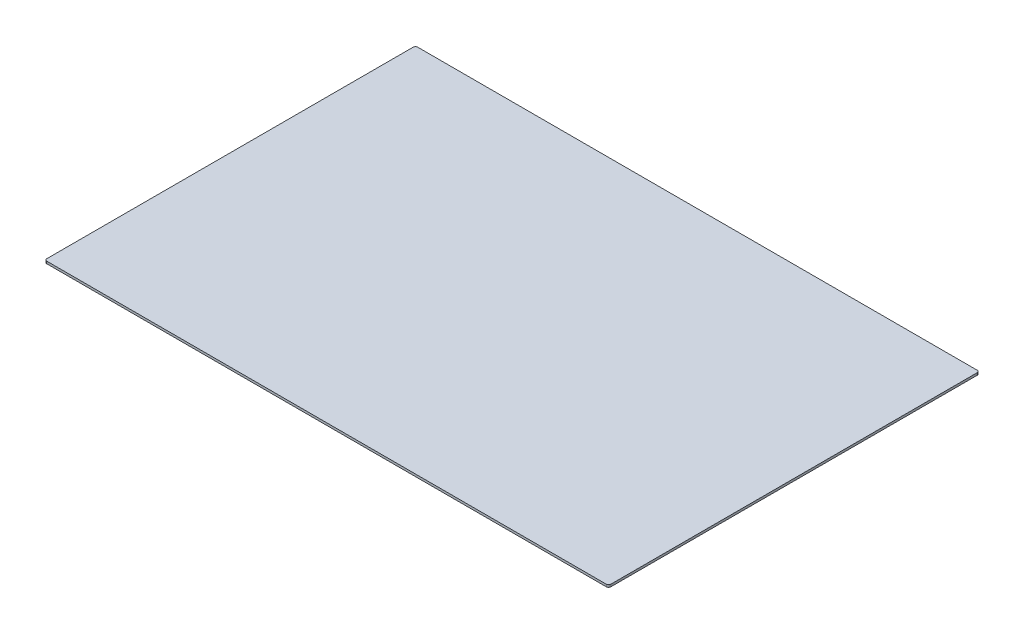
ISO-10303-21;
HEADER;
FILE_DESCRIPTION(('STEP AP214'),'2;1');
FILE_NAME('part.step','',(''),(''),'','','');
FILE_SCHEMA(('AUTOMOTIVE_DESIGN { 1 0 10303 214 1 1 1 1 }'));
ENDSEC;
DATA;
#1=APPLICATION_CONTEXT('core data for automotive mechanical design processes');
#2=APPLICATION_PROTOCOL_DEFINITION('international standard','automotive_design',2000,#1);
#3=PRODUCT_CONTEXT('',#1,'mechanical');
#4=PRODUCT('Part','Part','',(#3));
#5=PRODUCT_RELATED_PRODUCT_CATEGORY('part','',(#4));
#6=PRODUCT_DEFINITION_FORMATION('','',#4);
#7=PRODUCT_DEFINITION_CONTEXT('part definition',#1,'design');
#8=PRODUCT_DEFINITION('design','',#6,#7);
#9=PRODUCT_DEFINITION_SHAPE('','',#8);
#10=(LENGTH_UNIT() NAMED_UNIT(*) SI_UNIT(.MILLI.,.METRE.));
#11=(NAMED_UNIT(*) PLANE_ANGLE_UNIT() SI_UNIT($,.RADIAN.));
#12=(NAMED_UNIT(*) SI_UNIT($,.STERADIAN.) SOLID_ANGLE_UNIT());
#13=UNCERTAINTY_MEASURE_WITH_UNIT(LENGTH_MEASURE(1.E-05),#10,'distance_accuracy_value','');
#14=(GEOMETRIC_REPRESENTATION_CONTEXT(3) GLOBAL_UNCERTAINTY_ASSIGNED_CONTEXT((#13)) GLOBAL_UNIT_ASSIGNED_CONTEXT((#10,
#11,#12)) REPRESENTATION_CONTEXT('',''));
#15=CARTESIAN_POINT('',(0.,0.,0.));
#16=DIRECTION('',(0.,0.,1.));
#17=DIRECTION('',(1.,0.,0.));
#18=AXIS2_PLACEMENT_3D('',#15,#16,#17);
#19=CARTESIAN_POINT('',(61.75,0.5,-40.6));
#20=DIRECTION('',(-1.,0.,0.));
#21=DIRECTION('',(0.,0.,1.));
#22=AXIS2_PLACEMENT_3D('',#19,#20,#21);
#23=PLANE('',#22);
#24=DIRECTION('',(0.,0.,-1.));
#25=VECTOR('',#24,1.);
#26=CARTESIAN_POINT('',(61.75,0.5,-40.6));
#27=LINE('',#26,#25);
#28=CARTESIAN_POINT('',(61.75,0.5,40.1));
#29=VERTEX_POINT('',#28);
#30=CARTESIAN_POINT('',(61.75,0.5,-40.1));
#31=VERTEX_POINT('',#30);
#32=EDGE_CURVE('E118',#29,#31,#27,.T.);
#33=ORIENTED_EDGE('',*,*,#32,.F.);
#34=DIRECTION('',(0.,-1.,0.));
#35=VECTOR('',#34,1.);
#36=CARTESIAN_POINT('',(61.75,0.5,40.1));
#37=LINE('',#36,#35);
#38=CARTESIAN_POINT('',(61.75,0.,40.1));
#39=VERTEX_POINT('',#38);
#40=EDGE_CURVE('E103',#29,#39,#37,.T.);
#41=ORIENTED_EDGE('',*,*,#40,.T.);
#42=DIRECTION('',(0.,0.,-1.));
#43=VECTOR('',#42,1.);
#44=CARTESIAN_POINT('',(61.75,0.,-40.6));
#45=LINE('',#44,#43);
#46=CARTESIAN_POINT('',(61.75,0.,-40.1));
#47=VERTEX_POINT('',#46);
#48=EDGE_CURVE('E115',#39,#47,#45,.T.);
#49=ORIENTED_EDGE('',*,*,#48,.T.);
#50=DIRECTION('',(0.,-1.,0.));
#51=VECTOR('',#50,1.);
#52=CARTESIAN_POINT('',(61.75,0.5,-40.1));
#53=LINE('',#52,#51);
#54=EDGE_CURVE('E120',#47,#31,#53,.F.);
#55=ORIENTED_EDGE('',*,*,#54,.T.);
#56=EDGE_LOOP('',(#33,#41,#49,#55));
#57=FACE_BOUND('',#56,.T.);
#58=ADVANCED_FACE('F33',(#57),#23,.F.);
#59=CARTESIAN_POINT('',(-61.75,0.5,-40.6));
#60=DIRECTION('',(0.,0.,1.));
#61=DIRECTION('',(1.,0.,0.));
#62=AXIS2_PLACEMENT_3D('',#59,#60,#61);
#63=PLANE('',#62);
#64=DIRECTION('',(-1.,0.,0.));
#65=VECTOR('',#64,1.);
#66=CARTESIAN_POINT('',(-61.75,0.5,-40.6));
#67=LINE('',#66,#65);
#68=CARTESIAN_POINT('',(61.25,0.5,-40.6));
#69=VERTEX_POINT('',#68);
#70=CARTESIAN_POINT('',(-61.25,0.5,-40.6));
#71=VERTEX_POINT('',#70);
#72=EDGE_CURVE('E160',#69,#71,#67,.T.);
#73=ORIENTED_EDGE('',*,*,#72,.F.);
#74=DIRECTION('',(0.,-1.,0.));
#75=VECTOR('',#74,1.);
#76=CARTESIAN_POINT('',(61.25,0.5,-40.6));
#77=LINE('',#76,#75);
#78=CARTESIAN_POINT('',(61.25,0.,-40.6));
#79=VERTEX_POINT('',#78);
#80=EDGE_CURVE('E153',#69,#79,#77,.T.);
#81=ORIENTED_EDGE('',*,*,#80,.T.);
#82=DIRECTION('',(-1.,0.,0.));
#83=VECTOR('',#82,1.);
#84=CARTESIAN_POINT('',(-61.75,0.,-40.6));
#85=LINE('',#84,#83);
#86=CARTESIAN_POINT('',(-61.25,0.,-40.6));
#87=VERTEX_POINT('',#86);
#88=EDGE_CURVE('E124',#79,#87,#85,.T.);
#89=ORIENTED_EDGE('',*,*,#88,.T.);
#90=DIRECTION('',(0.,-1.,0.));
#91=VECTOR('',#90,1.);
#92=CARTESIAN_POINT('',(-61.25,0.5,-40.6));
#93=LINE('',#92,#91);
#94=EDGE_CURVE('E151',#87,#71,#93,.F.);
#95=ORIENTED_EDGE('',*,*,#94,.T.);
#96=EDGE_LOOP('',(#73,#81,#89,#95));
#97=FACE_BOUND('',#96,.T.);
#98=ADVANCED_FACE('F158',(#97),#63,.F.);
#99=CARTESIAN_POINT('',(-61.75,0.5,-40.6));
#100=DIRECTION('',(1.,0.,0.));
#101=DIRECTION('',(0.,0.,-1.));
#102=AXIS2_PLACEMENT_3D('',#99,#100,#101);
#103=PLANE('',#102);
#104=DIRECTION('',(0.,0.,1.));
#105=VECTOR('',#104,1.);
#106=CARTESIAN_POINT('',(-61.75,0.5,-40.6));
#107=LINE('',#106,#105);
#108=CARTESIAN_POINT('',(-61.75,0.5,-40.1));
#109=VERTEX_POINT('',#108);
#110=CARTESIAN_POINT('',(-61.75,0.5,40.1));
#111=VERTEX_POINT('',#110);
#112=EDGE_CURVE('E168',#109,#111,#107,.T.);
#113=ORIENTED_EDGE('',*,*,#112,.F.);
#114=DIRECTION('',(0.,-1.,0.));
#115=VECTOR('',#114,1.);
#116=CARTESIAN_POINT('',(-61.75,0.5,-40.1));
#117=LINE('',#116,#115);
#118=CARTESIAN_POINT('',(-61.75,0.,-40.1));
#119=VERTEX_POINT('',#118);
#120=EDGE_CURVE('E11',#109,#119,#117,.T.);
#121=ORIENTED_EDGE('',*,*,#120,.T.);
#122=DIRECTION('',(0.,0.,1.));
#123=VECTOR('',#122,1.);
#124=CARTESIAN_POINT('',(-61.75,0.,-40.6));
#125=LINE('',#124,#123);
#126=CARTESIAN_POINT('',(-61.75,0.,40.1));
#127=VERTEX_POINT('',#126);
#128=EDGE_CURVE('E127',#119,#127,#125,.T.);
#129=ORIENTED_EDGE('',*,*,#128,.T.);
#130=DIRECTION('',(0.,-1.,0.));
#131=VECTOR('',#130,1.);
#132=CARTESIAN_POINT('',(-61.75,0.5,40.1));
#133=LINE('',#132,#131);
#134=EDGE_CURVE('E41',#127,#111,#133,.F.);
#135=ORIENTED_EDGE('',*,*,#134,.T.);
#136=EDGE_LOOP('',(#113,#121,#129,#135));
#137=FACE_BOUND('',#136,.T.);
#138=ADVANCED_FACE('F167',(#137),#103,.F.);
#139=CARTESIAN_POINT('',(-61.75,0.5,40.6));
#140=DIRECTION('',(0.,0.,-1.));
#141=DIRECTION('',(-1.,0.,0.));
#142=AXIS2_PLACEMENT_3D('',#139,#140,#141);
#143=PLANE('',#142);
#144=DIRECTION('',(1.,0.,0.));
#145=VECTOR('',#144,1.);
#146=CARTESIAN_POINT('',(-61.75,0.,40.6));
#147=LINE('',#146,#145);
#148=CARTESIAN_POINT('',(-61.25,0.,40.6));
#149=VERTEX_POINT('',#148);
#150=CARTESIAN_POINT('',(61.25,0.,40.6));
#151=VERTEX_POINT('',#150);
#152=EDGE_CURVE('E134',#149,#151,#147,.T.);
#153=ORIENTED_EDGE('',*,*,#152,.T.);
#154=DIRECTION('',(0.,-1.,0.));
#155=VECTOR('',#154,1.);
#156=CARTESIAN_POINT('',(61.25,0.5,40.6));
#157=LINE('',#156,#155);
#158=CARTESIAN_POINT('',(61.25,0.5,40.6));
#159=VERTEX_POINT('',#158);
#160=EDGE_CURVE('E104',#151,#159,#157,.F.);
#161=ORIENTED_EDGE('',*,*,#160,.T.);
#162=DIRECTION('',(1.,0.,0.));
#163=VECTOR('',#162,1.);
#164=CARTESIAN_POINT('',(-61.75,0.5,40.6));
#165=LINE('',#164,#163);
#166=CARTESIAN_POINT('',(-61.25,0.5,40.6));
#167=VERTEX_POINT('',#166);
#168=EDGE_CURVE('E130',#167,#159,#165,.T.);
#169=ORIENTED_EDGE('',*,*,#168,.F.);
#170=DIRECTION('',(0.,-1.,0.));
#171=VECTOR('',#170,1.);
#172=CARTESIAN_POINT('',(-61.25,0.5,40.6));
#173=LINE('',#172,#171);
#174=EDGE_CURVE('E109',#167,#149,#173,.T.);
#175=ORIENTED_EDGE('',*,*,#174,.T.);
#176=EDGE_LOOP('',(#153,#161,#169,#175));
#177=FACE_BOUND('',#176,.T.);
#178=ADVANCED_FACE('F191',(#177),#143,.F.);
#179=CARTESIAN_POINT('',(0.,0.5,0.));
#180=DIRECTION('',(0.,1.,0.));
#181=DIRECTION('',(0.,0.,1.));
#182=AXIS2_PLACEMENT_3D('',#179,#180,#181);
#183=PLANE('',#182);
#184=ORIENTED_EDGE('',*,*,#168,.T.);
#185=CARTESIAN_POINT('',(61.25,0.5,40.1));
#186=DIRECTION('',(0.,1.,0.));
#187=DIRECTION('',(0.,0.,1.));
#188=AXIS2_PLACEMENT_3D('',#185,#186,#187);
#189=CIRCLE('',#188,0.5);
#190=EDGE_CURVE('E149',#159,#29,#189,.T.);
#191=ORIENTED_EDGE('',*,*,#190,.T.);
#192=ORIENTED_EDGE('',*,*,#32,.T.);
#193=CARTESIAN_POINT('',(61.25,0.5,-40.1));
#194=DIRECTION('',(0.,1.,0.));
#195=DIRECTION('',(0.,0.,1.));
#196=AXIS2_PLACEMENT_3D('',#193,#194,#195);
#197=CIRCLE('',#196,0.5);
#198=EDGE_CURVE('E147',#31,#69,#197,.T.);
#199=ORIENTED_EDGE('',*,*,#198,.T.);
#200=ORIENTED_EDGE('',*,*,#72,.T.);
#201=CARTESIAN_POINT('',(-61.25,0.5,-40.1));
#202=DIRECTION('',(0.,1.,0.));
#203=DIRECTION('',(0.,0.,1.));
#204=AXIS2_PLACEMENT_3D('',#201,#202,#203);
#205=CIRCLE('',#204,0.5);
#206=EDGE_CURVE('E54',#71,#109,#205,.T.);
#207=ORIENTED_EDGE('',*,*,#206,.T.);
#208=ORIENTED_EDGE('',*,*,#112,.T.);
#209=CARTESIAN_POINT('',(-61.25,0.5,40.1));
#210=DIRECTION('',(0.,1.,0.));
#211=DIRECTION('',(0.,0.,1.));
#212=AXIS2_PLACEMENT_3D('',#209,#210,#211);
#213=CIRCLE('',#212,0.5);
#214=EDGE_CURVE('E144',#111,#167,#213,.T.);
#215=ORIENTED_EDGE('',*,*,#214,.T.);
#216=EDGE_LOOP('',(#184,#191,#192,#199,#200,#207,#208,#215));
#217=FACE_BOUND('',#216,.T.);
#218=ADVANCED_FACE('F173',(#217),#183,.T.);
#219=CARTESIAN_POINT('',(0.,0.,0.));
#220=DIRECTION('',(0.,1.,0.));
#221=DIRECTION('',(0.,0.,1.));
#222=AXIS2_PLACEMENT_3D('',#219,#220,#221);
#223=PLANE('',#222);
#224=ORIENTED_EDGE('',*,*,#48,.F.);
#225=CARTESIAN_POINT('',(61.25,0.,40.1));
#226=DIRECTION('',(0.,1.,0.));
#227=DIRECTION('',(0.,0.,1.));
#228=AXIS2_PLACEMENT_3D('',#225,#226,#227);
#229=CIRCLE('',#228,0.5);
#230=EDGE_CURVE('E99',#39,#151,#229,.F.);
#231=ORIENTED_EDGE('',*,*,#230,.T.);
#232=ORIENTED_EDGE('',*,*,#152,.F.);
#233=CARTESIAN_POINT('',(-61.25,0.,40.1));
#234=DIRECTION('',(0.,1.,0.));
#235=DIRECTION('',(0.,0.,1.));
#236=AXIS2_PLACEMENT_3D('',#233,#234,#235);
#237=CIRCLE('',#236,0.5);
#238=EDGE_CURVE('E119',#149,#127,#237,.F.);
#239=ORIENTED_EDGE('',*,*,#238,.T.);
#240=ORIENTED_EDGE('',*,*,#128,.F.);
#241=CARTESIAN_POINT('',(-61.25,0.,-40.1));
#242=DIRECTION('',(0.,1.,0.));
#243=DIRECTION('',(0.,0.,1.));
#244=AXIS2_PLACEMENT_3D('',#241,#242,#243);
#245=CIRCLE('',#244,0.5);
#246=EDGE_CURVE('E138',#119,#87,#245,.F.);
#247=ORIENTED_EDGE('',*,*,#246,.T.);
#248=ORIENTED_EDGE('',*,*,#88,.F.);
#249=CARTESIAN_POINT('',(61.25,0.,-40.1));
#250=DIRECTION('',(0.,1.,0.));
#251=DIRECTION('',(0.,0.,1.));
#252=AXIS2_PLACEMENT_3D('',#249,#250,#251);
#253=CIRCLE('',#252,0.5);
#254=EDGE_CURVE('E110',#79,#47,#253,.F.);
#255=ORIENTED_EDGE('',*,*,#254,.T.);
#256=EDGE_LOOP('',(#224,#231,#232,#239,#240,#247,#248,#255));
#257=FACE_BOUND('',#256,.T.);
#258=ADVANCED_FACE('F122',(#257),#223,.F.);
#259=CARTESIAN_POINT('',(61.25,0.5,40.1));
#260=DIRECTION('',(0.,-1.,0.));
#261=DIRECTION('',(0.,0.,-1.));
#262=AXIS2_PLACEMENT_3D('',#259,#260,#261);
#263=CYLINDRICAL_SURFACE('',#262,0.5);
#264=ORIENTED_EDGE('',*,*,#190,.F.);
#265=ORIENTED_EDGE('',*,*,#160,.F.);
#266=ORIENTED_EDGE('',*,*,#230,.F.);
#267=ORIENTED_EDGE('',*,*,#40,.F.);
#268=EDGE_LOOP('',(#264,#265,#266,#267));
#269=FACE_BOUND('',#268,.T.);
#270=ADVANCED_FACE('F102',(#269),#263,.T.);
#271=CARTESIAN_POINT('',(61.25,0.5,-40.1));
#272=DIRECTION('',(0.,-1.,0.));
#273=DIRECTION('',(0.,0.,-1.));
#274=AXIS2_PLACEMENT_3D('',#271,#272,#273);
#275=CYLINDRICAL_SURFACE('',#274,0.5);
#276=ORIENTED_EDGE('',*,*,#198,.F.);
#277=ORIENTED_EDGE('',*,*,#54,.F.);
#278=ORIENTED_EDGE('',*,*,#254,.F.);
#279=ORIENTED_EDGE('',*,*,#80,.F.);
#280=EDGE_LOOP('',(#276,#277,#278,#279));
#281=FACE_BOUND('',#280,.T.);
#282=ADVANCED_FACE('F174',(#281),#275,.T.);
#283=CARTESIAN_POINT('',(-61.25,0.5,-40.1));
#284=DIRECTION('',(0.,-1.,0.));
#285=DIRECTION('',(0.,0.,-1.));
#286=AXIS2_PLACEMENT_3D('',#283,#284,#285);
#287=CYLINDRICAL_SURFACE('',#286,0.5);
#288=ORIENTED_EDGE('',*,*,#206,.F.);
#289=ORIENTED_EDGE('',*,*,#94,.F.);
#290=ORIENTED_EDGE('',*,*,#246,.F.);
#291=ORIENTED_EDGE('',*,*,#120,.F.);
#292=EDGE_LOOP('',(#288,#289,#290,#291));
#293=FACE_BOUND('',#292,.T.);
#294=ADVANCED_FACE('F166',(#293),#287,.T.);
#295=CARTESIAN_POINT('',(-61.25,0.5,40.1));
#296=DIRECTION('',(0.,-1.,0.));
#297=DIRECTION('',(0.,0.,-1.));
#298=AXIS2_PLACEMENT_3D('',#295,#296,#297);
#299=CYLINDRICAL_SURFACE('',#298,0.5);
#300=ORIENTED_EDGE('',*,*,#214,.F.);
#301=ORIENTED_EDGE('',*,*,#134,.F.);
#302=ORIENTED_EDGE('',*,*,#238,.F.);
#303=ORIENTED_EDGE('',*,*,#174,.F.);
#304=EDGE_LOOP('',(#300,#301,#302,#303));
#305=FACE_BOUND('',#304,.T.);
#306=ADVANCED_FACE('F35',(#305),#299,.T.);
#307=CLOSED_SHELL('',(#58,#98,#138,#178,#218,#258,#270,#282,#294,#306));
#308=MANIFOLD_SOLID_BREP('B2',#307);
#309=ADVANCED_BREP_SHAPE_REPRESENTATION('',(#18,#308),#14);
#310=SHAPE_DEFINITION_REPRESENTATION(#9,#309);
ENDSEC;
END-ISO-10303-21;
